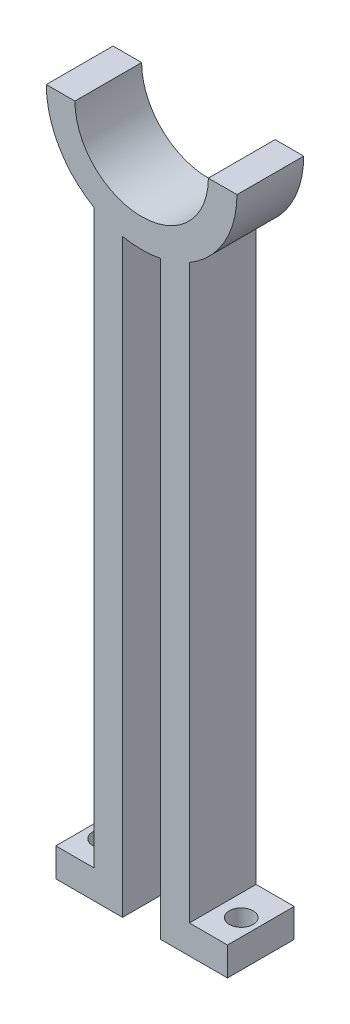
ISO-10303-21;
HEADER;
FILE_DESCRIPTION(('STEP AP214'),'2;1');
FILE_NAME('part.step','',(''),(''),'','','');
FILE_SCHEMA(('AUTOMOTIVE_DESIGN { 1 0 10303 214 1 1 1 1 }'));
ENDSEC;
DATA;
#1=APPLICATION_CONTEXT('core data for automotive mechanical design processes');
#2=APPLICATION_PROTOCOL_DEFINITION('international standard','automotive_design',2000,#1);
#3=PRODUCT_CONTEXT('',#1,'mechanical');
#4=PRODUCT('Part','Part','',(#3));
#5=PRODUCT_RELATED_PRODUCT_CATEGORY('part','',(#4));
#6=PRODUCT_DEFINITION_FORMATION('','',#4);
#7=PRODUCT_DEFINITION_CONTEXT('part definition',#1,'design');
#8=PRODUCT_DEFINITION('design','',#6,#7);
#9=PRODUCT_DEFINITION_SHAPE('','',#8);
#10=(LENGTH_UNIT() NAMED_UNIT(*) SI_UNIT(.MILLI.,.METRE.));
#11=(NAMED_UNIT(*) PLANE_ANGLE_UNIT() SI_UNIT($,.RADIAN.));
#12=(NAMED_UNIT(*) SI_UNIT($,.STERADIAN.) SOLID_ANGLE_UNIT());
#13=UNCERTAINTY_MEASURE_WITH_UNIT(LENGTH_MEASURE(1.E-05),#10,'distance_accuracy_value','');
#14=(GEOMETRIC_REPRESENTATION_CONTEXT(3) GLOBAL_UNCERTAINTY_ASSIGNED_CONTEXT((#13)) GLOBAL_UNIT_ASSIGNED_CONTEXT((#10,
#11,#12)) REPRESENTATION_CONTEXT('',''));
#15=CARTESIAN_POINT('',(0.,0.,0.));
#16=DIRECTION('',(0.,0.,1.));
#17=DIRECTION('',(1.,0.,0.));
#18=AXIS2_PLACEMENT_3D('',#15,#16,#17);
#19=CARTESIAN_POINT('',(0.,0.,7.));
#20=DIRECTION('',(0.,0.,-1.));
#21=DIRECTION('',(-1.,0.,0.));
#22=AXIS2_PLACEMENT_3D('',#19,#20,#21);
#23=CYLINDRICAL_SURFACE('',#22,7.);
#24=CARTESIAN_POINT('',(0.,0.,0.));
#25=DIRECTION('',(0.,0.,-1.));
#26=DIRECTION('',(1.,0.,0.));
#27=AXIS2_PLACEMENT_3D('',#24,#25,#26);
#28=CIRCLE('',#27,7.);
#29=CARTESIAN_POINT('',(7.,0.,0.));
#30=VERTEX_POINT('',#29);
#31=CARTESIAN_POINT('',(-7.,0.,0.));
#32=VERTEX_POINT('',#31);
#33=EDGE_CURVE('E184',#30,#32,#28,.T.);
#34=ORIENTED_EDGE('',*,*,#33,.T.);
#35=DIRECTION('',(0.,0.,-1.));
#36=VECTOR('',#35,1.);
#37=CARTESIAN_POINT('',(-7.,0.,7.));
#38=LINE('',#37,#36);
#39=CARTESIAN_POINT('',(-7.,0.,7.));
#40=VERTEX_POINT('',#39);
#41=EDGE_CURVE('E11',#40,#32,#38,.T.);
#42=ORIENTED_EDGE('',*,*,#41,.F.);
#43=CARTESIAN_POINT('',(0.,0.,7.));
#44=DIRECTION('',(0.,0.,-1.));
#45=DIRECTION('',(1.,0.,0.));
#46=AXIS2_PLACEMENT_3D('',#43,#44,#45);
#47=CIRCLE('',#46,7.);
#48=CARTESIAN_POINT('',(7.,0.,7.));
#49=VERTEX_POINT('',#48);
#50=EDGE_CURVE('E214',#49,#40,#47,.T.);
#51=ORIENTED_EDGE('',*,*,#50,.F.);
#52=DIRECTION('',(0.,0.,-1.));
#53=VECTOR('',#52,1.);
#54=CARTESIAN_POINT('',(7.,0.,7.));
#55=LINE('',#54,#53);
#56=EDGE_CURVE('E180',#49,#30,#55,.T.);
#57=ORIENTED_EDGE('',*,*,#56,.T.);
#58=EDGE_LOOP('',(#34,#42,#51,#57));
#59=FACE_BOUND('',#58,.T.);
#60=ADVANCED_FACE('F39',(#59),#23,.F.);
#61=CARTESIAN_POINT('',(-10.,0.,7.));
#62=DIRECTION('',(0.,-1.,0.));
#63=DIRECTION('',(0.,0.,-1.));
#64=AXIS2_PLACEMENT_3D('',#61,#62,#63);
#65=PLANE('',#64);
#66=DIRECTION('',(-1.,0.,0.));
#67=VECTOR('',#66,1.);
#68=CARTESIAN_POINT('',(-10.,0.,0.));
#69=LINE('',#68,#67);
#70=CARTESIAN_POINT('',(-10.,0.,0.));
#71=VERTEX_POINT('',#70);
#72=EDGE_CURVE('E187',#32,#71,#69,.T.);
#73=ORIENTED_EDGE('',*,*,#72,.T.);
#74=DIRECTION('',(0.,0.,-1.));
#75=VECTOR('',#74,1.);
#76=CARTESIAN_POINT('',(-10.,0.,7.));
#77=LINE('',#76,#75);
#78=CARTESIAN_POINT('',(-10.,0.,7.));
#79=VERTEX_POINT('',#78);
#80=EDGE_CURVE('E48',#79,#71,#77,.T.);
#81=ORIENTED_EDGE('',*,*,#80,.F.);
#82=DIRECTION('',(-1.,0.,0.));
#83=VECTOR('',#82,1.);
#84=CARTESIAN_POINT('',(-10.,0.,7.));
#85=LINE('',#84,#83);
#86=EDGE_CURVE('E123',#40,#79,#85,.T.);
#87=ORIENTED_EDGE('',*,*,#86,.F.);
#88=ORIENTED_EDGE('',*,*,#41,.T.);
#89=EDGE_LOOP('',(#73,#81,#87,#88));
#90=FACE_BOUND('',#89,.T.);
#91=ADVANCED_FACE('F313',(#90),#65,.F.);
#92=CARTESIAN_POINT('',(0.,0.,7.));
#93=DIRECTION('',(0.,0.,-1.));
#94=DIRECTION('',(-1.,0.,0.));
#95=AXIS2_PLACEMENT_3D('',#92,#93,#94);
#96=CYLINDRICAL_SURFACE('',#95,10.);
#97=CARTESIAN_POINT('',(0.,0.,0.));
#98=DIRECTION('',(0.,0.,1.));
#99=DIRECTION('',(1.,0.,0.));
#100=AXIS2_PLACEMENT_3D('',#97,#98,#99);
#101=CIRCLE('',#100,10.);
#102=CARTESIAN_POINT('',(-5.00488275949541,-8.65743313943028,0.));
#103=VERTEX_POINT('',#102);
#104=EDGE_CURVE('E189',#71,#103,#101,.T.);
#105=ORIENTED_EDGE('',*,*,#104,.T.);
#106=DIRECTION('',(0.,0.,-1.));
#107=VECTOR('',#106,1.);
#108=CARTESIAN_POINT('',(-5.00488275949541,-8.65743313943028,7.));
#109=LINE('',#108,#107);
#110=CARTESIAN_POINT('',(-5.00488275949541,-8.65743313943028,7.));
#111=VERTEX_POINT('',#110);
#112=EDGE_CURVE('E245',#111,#103,#109,.T.);
#113=ORIENTED_EDGE('',*,*,#112,.F.);
#114=CARTESIAN_POINT('',(0.,0.,7.));
#115=DIRECTION('',(0.,0.,1.));
#116=DIRECTION('',(1.,0.,0.));
#117=AXIS2_PLACEMENT_3D('',#114,#115,#116);
#118=CIRCLE('',#117,10.);
#119=EDGE_CURVE('E254',#79,#111,#118,.T.);
#120=ORIENTED_EDGE('',*,*,#119,.F.);
#121=ORIENTED_EDGE('',*,*,#80,.T.);
#122=EDGE_LOOP('',(#105,#113,#120,#121));
#123=FACE_BOUND('',#122,.T.);
#124=ADVANCED_FACE('F252',(#123),#96,.T.);
#125=CARTESIAN_POINT('',(-5.00488275949541,-8.65743313943028,7.));
#126=DIRECTION('',(1.,0.,0.));
#127=DIRECTION('',(0.,1.,0.));
#128=AXIS2_PLACEMENT_3D('',#125,#126,#127);
#129=PLANE('',#128);
#130=DIRECTION('',(0.,-1.,0.));
#131=VECTOR('',#130,1.);
#132=CARTESIAN_POINT('',(-5.00488275949541,-8.65743313943028,0.));
#133=LINE('',#132,#131);
#134=CARTESIAN_POINT('',(-5.0048827594954,-68.6574331394303,0.));
#135=VERTEX_POINT('',#134);
#136=EDGE_CURVE('E191',#103,#135,#133,.T.);
#137=ORIENTED_EDGE('',*,*,#136,.T.);
#138=DIRECTION('',(0.,0.,-1.));
#139=VECTOR('',#138,1.);
#140=CARTESIAN_POINT('',(-5.0048827594954,-68.6574331394303,7.));
#141=LINE('',#140,#139);
#142=CARTESIAN_POINT('',(-5.0048827594954,-68.6574331394303,7.));
#143=VERTEX_POINT('',#142);
#144=EDGE_CURVE('E242',#143,#135,#141,.T.);
#145=ORIENTED_EDGE('',*,*,#144,.F.);
#146=DIRECTION('',(0.,-1.,0.));
#147=VECTOR('',#146,1.);
#148=CARTESIAN_POINT('',(-5.00488275949541,-8.65743313943028,7.));
#149=LINE('',#148,#147);
#150=EDGE_CURVE('E272',#111,#143,#149,.T.);
#151=ORIENTED_EDGE('',*,*,#150,.F.);
#152=ORIENTED_EDGE('',*,*,#112,.T.);
#153=EDGE_LOOP('',(#137,#145,#151,#152));
#154=FACE_BOUND('',#153,.T.);
#155=ADVANCED_FACE('F263',(#154),#129,.F.);
#156=CARTESIAN_POINT('',(-5.0048827594954,-68.6574331394303,7.));
#157=DIRECTION('',(0.,-1.,0.));
#158=DIRECTION('',(0.,0.,-1.));
#159=AXIS2_PLACEMENT_3D('',#156,#157,#158);
#160=PLANE('',#159);
#161=CARTESIAN_POINT('',(-7.0845263963335,-68.6574331394303,3.79533670718279));
#162=DIRECTION('',(0.,1.,0.));
#163=DIRECTION('',(0.,0.,1.));
#164=AXIS2_PLACEMENT_3D('',#161,#162,#163);
#165=CIRCLE('',#164,1.25);
#166=CARTESIAN_POINT('',(-7.0845263963335,-68.6574331394303,5.04533670718279));
#167=VERTEX_POINT('',#166);
#168=EDGE_CURVE('E563',#167,#167,#165,.T.);
#169=ORIENTED_EDGE('',*,*,#168,.F.);
#170=EDGE_LOOP('',(#169));
#171=FACE_BOUND('',#170,.T.);
#172=DIRECTION('',(-1.,0.,0.));
#173=VECTOR('',#172,1.);
#174=CARTESIAN_POINT('',(-5.0048827594954,-68.6574331394303,0.));
#175=LINE('',#174,#173);
#176=CARTESIAN_POINT('',(-9.0048827594954,-68.6574331394303,0.));
#177=VERTEX_POINT('',#176);
#178=EDGE_CURVE('E193',#135,#177,#175,.T.);
#179=ORIENTED_EDGE('',*,*,#178,.T.);
#180=DIRECTION('',(0.,0.,-1.));
#181=VECTOR('',#180,1.);
#182=CARTESIAN_POINT('',(-9.0048827594954,-68.6574331394303,7.));
#183=LINE('',#182,#181);
#184=CARTESIAN_POINT('',(-9.0048827594954,-68.6574331394303,7.));
#185=VERTEX_POINT('',#184);
#186=EDGE_CURVE('E239',#185,#177,#183,.T.);
#187=ORIENTED_EDGE('',*,*,#186,.F.);
#188=DIRECTION('',(-1.,0.,0.));
#189=VECTOR('',#188,1.);
#190=CARTESIAN_POINT('',(-5.0048827594954,-68.6574331394303,7.));
#191=LINE('',#190,#189);
#192=EDGE_CURVE('E269',#143,#185,#191,.T.);
#193=ORIENTED_EDGE('',*,*,#192,.F.);
#194=ORIENTED_EDGE('',*,*,#144,.T.);
#195=EDGE_LOOP('',(#179,#187,#193,#194));
#196=FACE_BOUND('',#195,.T.);
#197=ADVANCED_FACE('F267',(#171,#196),#160,.F.);
#198=CARTESIAN_POINT('',(-9.0048827594954,-68.6574331394303,7.));
#199=DIRECTION('',(1.,0.,0.));
#200=DIRECTION('',(0.,1.,0.));
#201=AXIS2_PLACEMENT_3D('',#198,#199,#200);
#202=PLANE('',#201);
#203=DIRECTION('',(0.,-1.,0.));
#204=VECTOR('',#203,1.);
#205=CARTESIAN_POINT('',(-9.0048827594954,-68.6574331394303,0.));
#206=LINE('',#205,#204);
#207=CARTESIAN_POINT('',(-9.0048827594954,-71.6574331394303,0.));
#208=VERTEX_POINT('',#207);
#209=EDGE_CURVE('E195',#177,#208,#206,.T.);
#210=ORIENTED_EDGE('',*,*,#209,.T.);
#211=DIRECTION('',(0.,0.,-1.));
#212=VECTOR('',#211,1.);
#213=CARTESIAN_POINT('',(-9.0048827594954,-71.6574331394303,7.));
#214=LINE('',#213,#212);
#215=CARTESIAN_POINT('',(-9.0048827594954,-71.6574331394303,7.));
#216=VERTEX_POINT('',#215);
#217=EDGE_CURVE('E236',#216,#208,#214,.T.);
#218=ORIENTED_EDGE('',*,*,#217,.F.);
#219=DIRECTION('',(0.,-1.,0.));
#220=VECTOR('',#219,1.);
#221=CARTESIAN_POINT('',(-9.0048827594954,-68.6574331394303,7.));
#222=LINE('',#221,#220);
#223=EDGE_CURVE('E271',#185,#216,#222,.T.);
#224=ORIENTED_EDGE('',*,*,#223,.F.);
#225=ORIENTED_EDGE('',*,*,#186,.T.);
#226=EDGE_LOOP('',(#210,#218,#224,#225));
#227=FACE_BOUND('',#226,.T.);
#228=ADVANCED_FACE('F326',(#227),#202,.F.);
#229=CARTESIAN_POINT('',(-9.0048827594954,-71.6574331394303,7.));
#230=DIRECTION('',(0.,1.,0.));
#231=DIRECTION('',(0.,0.,1.));
#232=AXIS2_PLACEMENT_3D('',#229,#230,#231);
#233=PLANE('',#232);
#234=CARTESIAN_POINT('',(-7.0845263963335,-71.6574331394303,3.79533670718279));
#235=DIRECTION('',(0.,1.,0.));
#236=DIRECTION('',(0.,0.,1.));
#237=AXIS2_PLACEMENT_3D('',#234,#235,#236);
#238=CIRCLE('',#237,1.25);
#239=CARTESIAN_POINT('',(-7.0845263963335,-71.6574331394303,5.04533670718279));
#240=VERTEX_POINT('',#239);
#241=EDGE_CURVE('E42',#240,#240,#238,.T.);
#242=ORIENTED_EDGE('',*,*,#241,.T.);
#243=EDGE_LOOP('',(#242));
#244=FACE_BOUND('',#243,.T.);
#245=DIRECTION('',(1.,0.,0.));
#246=VECTOR('',#245,1.);
#247=CARTESIAN_POINT('',(-9.0048827594954,-71.6574331394303,0.));
#248=LINE('',#247,#246);
#249=CARTESIAN_POINT('',(-2.0048827594954,-71.6574331394303,0.));
#250=VERTEX_POINT('',#249);
#251=EDGE_CURVE('E197',#208,#250,#248,.T.);
#252=ORIENTED_EDGE('',*,*,#251,.T.);
#253=DIRECTION('',(0.,0.,-1.));
#254=VECTOR('',#253,1.);
#255=CARTESIAN_POINT('',(-2.0048827594954,-71.6574331394303,7.));
#256=LINE('',#255,#254);
#257=CARTESIAN_POINT('',(-2.0048827594954,-71.6574331394303,7.));
#258=VERTEX_POINT('',#257);
#259=EDGE_CURVE('E233',#258,#250,#256,.T.);
#260=ORIENTED_EDGE('',*,*,#259,.F.);
#261=DIRECTION('',(1.,0.,0.));
#262=VECTOR('',#261,1.);
#263=CARTESIAN_POINT('',(-9.0048827594954,-71.6574331394303,7.));
#264=LINE('',#263,#262);
#265=EDGE_CURVE('E274',#216,#258,#264,.T.);
#266=ORIENTED_EDGE('',*,*,#265,.F.);
#267=ORIENTED_EDGE('',*,*,#217,.T.);
#268=EDGE_LOOP('',(#252,#260,#266,#267));
#269=FACE_BOUND('',#268,.T.);
#270=ADVANCED_FACE('F330',(#244,#269),#233,.F.);
#271=CARTESIAN_POINT('',(-2.0048827594954,-71.6574331394303,7.));
#272=DIRECTION('',(-1.,0.,0.));
#273=DIRECTION('',(0.,-1.,0.));
#274=AXIS2_PLACEMENT_3D('',#271,#272,#273);
#275=PLANE('',#274);
#276=DIRECTION('',(0.,1.,0.));
#277=VECTOR('',#276,1.);
#278=CARTESIAN_POINT('',(-2.0048827594954,-71.6574331394303,0.));
#279=LINE('',#278,#277);
#280=CARTESIAN_POINT('',(-2.00488275949541,-9.79696101455334,0.));
#281=VERTEX_POINT('',#280);
#282=EDGE_CURVE('E199',#250,#281,#279,.T.);
#283=ORIENTED_EDGE('',*,*,#282,.T.);
#284=DIRECTION('',(0.,0.,-1.));
#285=VECTOR('',#284,1.);
#286=CARTESIAN_POINT('',(-2.00488275949541,-9.79696101455334,7.));
#287=LINE('',#286,#285);
#288=CARTESIAN_POINT('',(-2.00488275949541,-9.79696101455334,7.));
#289=VERTEX_POINT('',#288);
#290=EDGE_CURVE('E230',#289,#281,#287,.T.);
#291=ORIENTED_EDGE('',*,*,#290,.F.);
#292=DIRECTION('',(0.,1.,0.));
#293=VECTOR('',#292,1.);
#294=CARTESIAN_POINT('',(-2.0048827594954,-71.6574331394303,7.));
#295=LINE('',#294,#293);
#296=EDGE_CURVE('E280',#258,#289,#295,.T.);
#297=ORIENTED_EDGE('',*,*,#296,.F.);
#298=ORIENTED_EDGE('',*,*,#259,.T.);
#299=EDGE_LOOP('',(#283,#291,#297,#298));
#300=FACE_BOUND('',#299,.T.);
#301=ADVANCED_FACE('F334',(#300),#275,.F.);
#302=CARTESIAN_POINT('',(0.,0.,7.));
#303=DIRECTION('',(0.,0.,-1.));
#304=DIRECTION('',(-1.,0.,0.));
#305=AXIS2_PLACEMENT_3D('',#302,#303,#304);
#306=CYLINDRICAL_SURFACE('',#305,10.);
#307=CARTESIAN_POINT('',(0.,0.,0.));
#308=DIRECTION('',(0.,0.,1.));
#309=DIRECTION('',(1.,0.,0.));
#310=AXIS2_PLACEMENT_3D('',#307,#308,#309);
#311=CIRCLE('',#310,10.);
#312=CARTESIAN_POINT('',(2.0048827594954,-9.79696101455334,0.));
#313=VERTEX_POINT('',#312);
#314=EDGE_CURVE('E201',#281,#313,#311,.T.);
#315=ORIENTED_EDGE('',*,*,#314,.T.);
#316=DIRECTION('',(0.,0.,-1.));
#317=VECTOR('',#316,1.);
#318=CARTESIAN_POINT('',(2.0048827594954,-9.79696101455334,7.));
#319=LINE('',#318,#317);
#320=CARTESIAN_POINT('',(2.0048827594954,-9.79696101455334,7.));
#321=VERTEX_POINT('',#320);
#322=EDGE_CURVE('E227',#321,#313,#319,.T.);
#323=ORIENTED_EDGE('',*,*,#322,.F.);
#324=CARTESIAN_POINT('',(0.,0.,7.));
#325=DIRECTION('',(0.,0.,1.));
#326=DIRECTION('',(1.,0.,0.));
#327=AXIS2_PLACEMENT_3D('',#324,#325,#326);
#328=CIRCLE('',#327,10.);
#329=EDGE_CURVE('E282',#289,#321,#328,.T.);
#330=ORIENTED_EDGE('',*,*,#329,.F.);
#331=ORIENTED_EDGE('',*,*,#290,.T.);
#332=EDGE_LOOP('',(#315,#323,#330,#331));
#333=FACE_BOUND('',#332,.T.);
#334=ADVANCED_FACE('F338',(#333),#306,.T.);
#335=CARTESIAN_POINT('',(2.00488275949542,-71.6574331394303,7.));
#336=DIRECTION('',(1.,0.,0.));
#337=DIRECTION('',(0.,1.,0.));
#338=AXIS2_PLACEMENT_3D('',#335,#336,#337);
#339=PLANE('',#338);
#340=DIRECTION('',(0.,-1.,0.));
#341=VECTOR('',#340,1.);
#342=CARTESIAN_POINT('',(2.00488275949542,-71.6574331394303,0.));
#343=LINE('',#342,#341);
#344=CARTESIAN_POINT('',(2.00488275949542,-71.6574331394303,0.));
#345=VERTEX_POINT('',#344);
#346=EDGE_CURVE('E203',#313,#345,#343,.T.);
#347=ORIENTED_EDGE('',*,*,#346,.T.);
#348=DIRECTION('',(0.,0.,-1.));
#349=VECTOR('',#348,1.);
#350=CARTESIAN_POINT('',(2.00488275949542,-71.6574331394303,7.));
#351=LINE('',#350,#349);
#352=CARTESIAN_POINT('',(2.00488275949542,-71.6574331394303,7.));
#353=VERTEX_POINT('',#352);
#354=EDGE_CURVE('E224',#353,#345,#351,.T.);
#355=ORIENTED_EDGE('',*,*,#354,.F.);
#356=DIRECTION('',(0.,-1.,0.));
#357=VECTOR('',#356,1.);
#358=CARTESIAN_POINT('',(2.00488275949542,-71.6574331394303,7.));
#359=LINE('',#358,#357);
#360=EDGE_CURVE('E284',#321,#353,#359,.T.);
#361=ORIENTED_EDGE('',*,*,#360,.F.);
#362=ORIENTED_EDGE('',*,*,#322,.T.);
#363=EDGE_LOOP('',(#347,#355,#361,#362));
#364=FACE_BOUND('',#363,.T.);
#365=ADVANCED_FACE('F342',(#364),#339,.F.);
#366=CARTESIAN_POINT('',(9.00488275949542,-71.6574331394303,7.));
#367=DIRECTION('',(0.,1.,0.));
#368=DIRECTION('',(0.,0.,1.));
#369=AXIS2_PLACEMENT_3D('',#366,#367,#368);
#370=PLANE('',#369);
#371=CARTESIAN_POINT('',(7.23936675835724,-71.6574331394303,3.79533670718279));
#372=DIRECTION('',(0.,1.,0.));
#373=DIRECTION('',(0.,0.,1.));
#374=AXIS2_PLACEMENT_3D('',#371,#372,#373);
#375=CIRCLE('',#374,1.25);
#376=CARTESIAN_POINT('',(7.23936675835724,-71.6574331394303,5.04533670718279));
#377=VERTEX_POINT('',#376);
#378=EDGE_CURVE('E566',#377,#377,#375,.T.);
#379=ORIENTED_EDGE('',*,*,#378,.T.);
#380=EDGE_LOOP('',(#379));
#381=FACE_BOUND('',#380,.T.);
#382=DIRECTION('',(1.,0.,0.));
#383=VECTOR('',#382,1.);
#384=CARTESIAN_POINT('',(9.00488275949542,-71.6574331394303,0.));
#385=LINE('',#384,#383);
#386=CARTESIAN_POINT('',(9.00488275949542,-71.6574331394303,0.));
#387=VERTEX_POINT('',#386);
#388=EDGE_CURVE('E205',#345,#387,#385,.T.);
#389=ORIENTED_EDGE('',*,*,#388,.T.);
#390=DIRECTION('',(0.,0.,-1.));
#391=VECTOR('',#390,1.);
#392=CARTESIAN_POINT('',(9.00488275949542,-71.6574331394303,7.));
#393=LINE('',#392,#391);
#394=CARTESIAN_POINT('',(9.00488275949542,-71.6574331394303,7.));
#395=VERTEX_POINT('',#394);
#396=EDGE_CURVE('E221',#395,#387,#393,.T.);
#397=ORIENTED_EDGE('',*,*,#396,.F.);
#398=DIRECTION('',(1.,0.,0.));
#399=VECTOR('',#398,1.);
#400=CARTESIAN_POINT('',(9.00488275949542,-71.6574331394303,7.));
#401=LINE('',#400,#399);
#402=EDGE_CURVE('E286',#353,#395,#401,.T.);
#403=ORIENTED_EDGE('',*,*,#402,.F.);
#404=ORIENTED_EDGE('',*,*,#354,.T.);
#405=EDGE_LOOP('',(#389,#397,#403,#404));
#406=FACE_BOUND('',#405,.T.);
#407=ADVANCED_FACE('F346',(#381,#406),#370,.F.);
#408=CARTESIAN_POINT('',(9.00488275949542,-68.6574331394303,7.));
#409=DIRECTION('',(-1.,0.,0.));
#410=DIRECTION('',(0.,-1.,0.));
#411=AXIS2_PLACEMENT_3D('',#408,#409,#410);
#412=PLANE('',#411);
#413=DIRECTION('',(0.,1.,0.));
#414=VECTOR('',#413,1.);
#415=CARTESIAN_POINT('',(9.00488275949542,-68.6574331394303,0.));
#416=LINE('',#415,#414);
#417=CARTESIAN_POINT('',(9.00488275949542,-68.6574331394303,0.));
#418=VERTEX_POINT('',#417);
#419=EDGE_CURVE('E207',#387,#418,#416,.T.);
#420=ORIENTED_EDGE('',*,*,#419,.T.);
#421=DIRECTION('',(0.,0.,-1.));
#422=VECTOR('',#421,1.);
#423=CARTESIAN_POINT('',(9.00488275949542,-68.6574331394303,7.));
#424=LINE('',#423,#422);
#425=CARTESIAN_POINT('',(9.00488275949542,-68.6574331394303,7.));
#426=VERTEX_POINT('',#425);
#427=EDGE_CURVE('E218',#426,#418,#424,.T.);
#428=ORIENTED_EDGE('',*,*,#427,.F.);
#429=DIRECTION('',(0.,1.,0.));
#430=VECTOR('',#429,1.);
#431=CARTESIAN_POINT('',(9.00488275949542,-68.6574331394303,7.));
#432=LINE('',#431,#430);
#433=EDGE_CURVE('E288',#395,#426,#432,.T.);
#434=ORIENTED_EDGE('',*,*,#433,.F.);
#435=ORIENTED_EDGE('',*,*,#396,.T.);
#436=EDGE_LOOP('',(#420,#428,#434,#435));
#437=FACE_BOUND('',#436,.T.);
#438=ADVANCED_FACE('F294',(#437),#412,.F.);
#439=CARTESIAN_POINT('',(5.00488275949542,-68.6574331394303,7.));
#440=DIRECTION('',(0.,-1.,0.));
#441=DIRECTION('',(0.,0.,-1.));
#442=AXIS2_PLACEMENT_3D('',#439,#440,#441);
#443=PLANE('',#442);
#444=CARTESIAN_POINT('',(7.23936675835724,-68.6574331394303,3.79533670718279));
#445=DIRECTION('',(0.,1.,0.));
#446=DIRECTION('',(0.,0.,1.));
#447=AXIS2_PLACEMENT_3D('',#444,#445,#446);
#448=CIRCLE('',#447,1.25);
#449=CARTESIAN_POINT('',(7.23936675835724,-68.6574331394303,5.04533670718279));
#450=VERTEX_POINT('',#449);
#451=EDGE_CURVE('E570',#450,#450,#448,.T.);
#452=ORIENTED_EDGE('',*,*,#451,.F.);
#453=EDGE_LOOP('',(#452));
#454=FACE_BOUND('',#453,.T.);
#455=DIRECTION('',(-1.,0.,0.));
#456=VECTOR('',#455,1.);
#457=CARTESIAN_POINT('',(5.00488275949542,-68.6574331394303,0.));
#458=LINE('',#457,#456);
#459=CARTESIAN_POINT('',(5.00488275949542,-68.6574331394303,0.));
#460=VERTEX_POINT('',#459);
#461=EDGE_CURVE('E209',#418,#460,#458,.T.);
#462=ORIENTED_EDGE('',*,*,#461,.T.);
#463=DIRECTION('',(0.,0.,-1.));
#464=VECTOR('',#463,1.);
#465=CARTESIAN_POINT('',(5.00488275949542,-68.6574331394303,7.));
#466=LINE('',#465,#464);
#467=CARTESIAN_POINT('',(5.00488275949542,-68.6574331394303,7.));
#468=VERTEX_POINT('',#467);
#469=EDGE_CURVE('E175',#468,#460,#466,.T.);
#470=ORIENTED_EDGE('',*,*,#469,.F.);
#471=DIRECTION('',(-1.,0.,0.));
#472=VECTOR('',#471,1.);
#473=CARTESIAN_POINT('',(5.00488275949542,-68.6574331394303,7.));
#474=LINE('',#473,#472);
#475=EDGE_CURVE('E166',#426,#468,#474,.T.);
#476=ORIENTED_EDGE('',*,*,#475,.F.);
#477=ORIENTED_EDGE('',*,*,#427,.T.);
#478=EDGE_LOOP('',(#462,#470,#476,#477));
#479=FACE_BOUND('',#478,.T.);
#480=ADVANCED_FACE('F298',(#454,#479),#443,.F.);
#481=CARTESIAN_POINT('',(5.00488275949541,-8.65743313943028,7.));
#482=DIRECTION('',(-1.,0.,0.));
#483=DIRECTION('',(0.,-1.,0.));
#484=AXIS2_PLACEMENT_3D('',#481,#482,#483);
#485=PLANE('',#484);
#486=DIRECTION('',(0.,1.,0.));
#487=VECTOR('',#486,1.);
#488=CARTESIAN_POINT('',(5.00488275949541,-8.65743313943028,0.));
#489=LINE('',#488,#487);
#490=CARTESIAN_POINT('',(5.0048827594954,-8.65743313943028,0.));
#491=VERTEX_POINT('',#490);
#492=EDGE_CURVE('E174',#460,#491,#489,.T.);
#493=ORIENTED_EDGE('',*,*,#492,.T.);
#494=DIRECTION('',(0.,0.,-1.));
#495=VECTOR('',#494,1.);
#496=CARTESIAN_POINT('',(5.0048827594954,-8.65743313943028,7.));
#497=LINE('',#496,#495);
#498=CARTESIAN_POINT('',(5.0048827594954,-8.65743313943028,7.));
#499=VERTEX_POINT('',#498);
#500=EDGE_CURVE('E171',#499,#491,#497,.T.);
#501=ORIENTED_EDGE('',*,*,#500,.F.);
#502=DIRECTION('',(0.,1.,0.));
#503=VECTOR('',#502,1.);
#504=CARTESIAN_POINT('',(5.00488275949541,-8.65743313943028,7.));
#505=LINE('',#504,#503);
#506=EDGE_CURVE('E160',#468,#499,#505,.T.);
#507=ORIENTED_EDGE('',*,*,#506,.F.);
#508=ORIENTED_EDGE('',*,*,#469,.T.);
#509=EDGE_LOOP('',(#493,#501,#507,#508));
#510=FACE_BOUND('',#509,.T.);
#511=ADVANCED_FACE('F172',(#510),#485,.F.);
#512=CARTESIAN_POINT('',(0.,0.,7.));
#513=DIRECTION('',(0.,0.,-1.));
#514=DIRECTION('',(-1.,0.,0.));
#515=AXIS2_PLACEMENT_3D('',#512,#513,#514);
#516=CYLINDRICAL_SURFACE('',#515,10.);
#517=CARTESIAN_POINT('',(0.,0.,0.));
#518=DIRECTION('',(0.,0.,1.));
#519=DIRECTION('',(1.,0.,0.));
#520=AXIS2_PLACEMENT_3D('',#517,#518,#519);
#521=CIRCLE('',#520,10.);
#522=CARTESIAN_POINT('',(10.,0.,0.));
#523=VERTEX_POINT('',#522);
#524=EDGE_CURVE('E109',#491,#523,#521,.T.);
#525=ORIENTED_EDGE('',*,*,#524,.T.);
#526=DIRECTION('',(0.,0.,-1.));
#527=VECTOR('',#526,1.);
#528=CARTESIAN_POINT('',(10.,0.,7.));
#529=LINE('',#528,#527);
#530=CARTESIAN_POINT('',(10.,0.,7.));
#531=VERTEX_POINT('',#530);
#532=EDGE_CURVE('E176',#531,#523,#529,.T.);
#533=ORIENTED_EDGE('',*,*,#532,.F.);
#534=CARTESIAN_POINT('',(0.,0.,7.));
#535=DIRECTION('',(0.,0.,1.));
#536=DIRECTION('',(1.,0.,0.));
#537=AXIS2_PLACEMENT_3D('',#534,#535,#536);
#538=CIRCLE('',#537,10.);
#539=EDGE_CURVE('E164',#499,#531,#538,.T.);
#540=ORIENTED_EDGE('',*,*,#539,.F.);
#541=ORIENTED_EDGE('',*,*,#500,.T.);
#542=EDGE_LOOP('',(#525,#533,#540,#541));
#543=FACE_BOUND('',#542,.T.);
#544=ADVANCED_FACE('F178',(#543),#516,.T.);
#545=CARTESIAN_POINT('',(7.,0.,7.));
#546=DIRECTION('',(0.,-1.,0.));
#547=DIRECTION('',(0.,0.,-1.));
#548=AXIS2_PLACEMENT_3D('',#545,#546,#547);
#549=PLANE('',#548);
#550=DIRECTION('',(-1.,0.,0.));
#551=VECTOR('',#550,1.);
#552=CARTESIAN_POINT('',(7.,0.,0.));
#553=LINE('',#552,#551);
#554=EDGE_CURVE('E115',#523,#30,#553,.T.);
#555=ORIENTED_EDGE('',*,*,#554,.T.);
#556=ORIENTED_EDGE('',*,*,#56,.F.);
#557=DIRECTION('',(-1.,0.,0.));
#558=VECTOR('',#557,1.);
#559=CARTESIAN_POINT('',(7.,0.,7.));
#560=LINE('',#559,#558);
#561=EDGE_CURVE('E56',#531,#49,#560,.T.);
#562=ORIENTED_EDGE('',*,*,#561,.F.);
#563=ORIENTED_EDGE('',*,*,#532,.T.);
#564=EDGE_LOOP('',(#555,#556,#562,#563));
#565=FACE_BOUND('',#564,.T.);
#566=ADVANCED_FACE('F302',(#565),#549,.F.);
#567=CARTESIAN_POINT('',(0.,0.,7.));
#568=DIRECTION('',(0.,0.,1.));
#569=DIRECTION('',(1.,0.,0.));
#570=AXIS2_PLACEMENT_3D('',#567,#568,#569);
#571=PLANE('',#570);
#572=ORIENTED_EDGE('',*,*,#50,.T.);
#573=ORIENTED_EDGE('',*,*,#86,.T.);
#574=ORIENTED_EDGE('',*,*,#119,.T.);
#575=ORIENTED_EDGE('',*,*,#150,.T.);
#576=ORIENTED_EDGE('',*,*,#192,.T.);
#577=ORIENTED_EDGE('',*,*,#223,.T.);
#578=ORIENTED_EDGE('',*,*,#265,.T.);
#579=ORIENTED_EDGE('',*,*,#296,.T.);
#580=ORIENTED_EDGE('',*,*,#329,.T.);
#581=ORIENTED_EDGE('',*,*,#360,.T.);
#582=ORIENTED_EDGE('',*,*,#402,.T.);
#583=ORIENTED_EDGE('',*,*,#433,.T.);
#584=ORIENTED_EDGE('',*,*,#475,.T.);
#585=ORIENTED_EDGE('',*,*,#506,.T.);
#586=ORIENTED_EDGE('',*,*,#539,.T.);
#587=ORIENTED_EDGE('',*,*,#561,.T.);
#588=EDGE_LOOP('',(#572,#573,#574,#575,#576,#577,#578,#579,#580,#581,#582,#583,#584,#585,#586,#587));
#589=FACE_BOUND('',#588,.T.);
#590=ADVANCED_FACE('F162',(#589),#571,.T.);
#591=CARTESIAN_POINT('',(0.,0.,0.));
#592=DIRECTION('',(0.,0.,1.));
#593=DIRECTION('',(1.,0.,0.));
#594=AXIS2_PLACEMENT_3D('',#591,#592,#593);
#595=PLANE('',#594);
#596=ORIENTED_EDGE('',*,*,#33,.F.);
#597=ORIENTED_EDGE('',*,*,#554,.F.);
#598=ORIENTED_EDGE('',*,*,#524,.F.);
#599=ORIENTED_EDGE('',*,*,#492,.F.);
#600=ORIENTED_EDGE('',*,*,#461,.F.);
#601=ORIENTED_EDGE('',*,*,#419,.F.);
#602=ORIENTED_EDGE('',*,*,#388,.F.);
#603=ORIENTED_EDGE('',*,*,#346,.F.);
#604=ORIENTED_EDGE('',*,*,#314,.F.);
#605=ORIENTED_EDGE('',*,*,#282,.F.);
#606=ORIENTED_EDGE('',*,*,#251,.F.);
#607=ORIENTED_EDGE('',*,*,#209,.F.);
#608=ORIENTED_EDGE('',*,*,#178,.F.);
#609=ORIENTED_EDGE('',*,*,#136,.F.);
#610=ORIENTED_EDGE('',*,*,#104,.F.);
#611=ORIENTED_EDGE('',*,*,#72,.F.);
#612=EDGE_LOOP('',(#596,#597,#598,#599,#600,#601,#602,#603,#604,#605,#606,#607,#608,#609,#610,#611));
#613=FACE_BOUND('',#612,.T.);
#614=ADVANCED_FACE('F258',(#613),#595,.F.);
#615=CARTESIAN_POINT('',(7.23936675835724,-78.6574331394303,3.79533670718279));
#616=DIRECTION('',(0.,1.,0.));
#617=DIRECTION('',(0.,0.,1.));
#618=AXIS2_PLACEMENT_3D('',#615,#616,#617);
#619=CYLINDRICAL_SURFACE('',#618,1.25);
#620=ORIENTED_EDGE('',*,*,#451,.T.);
#621=EDGE_LOOP('',(#620));
#622=FACE_BOUND('',#621,.T.);
#623=ORIENTED_EDGE('',*,*,#378,.F.);
#624=EDGE_LOOP('',(#623));
#625=FACE_BOUND('',#624,.T.);
#626=ADVANCED_FACE('F384',(#622,#625),#619,.F.);
#627=CARTESIAN_POINT('',(-7.0845263963335,-78.6574331394303,3.79533670718279));
#628=DIRECTION('',(0.,1.,0.));
#629=DIRECTION('',(0.,0.,1.));
#630=AXIS2_PLACEMENT_3D('',#627,#628,#629);
#631=CYLINDRICAL_SURFACE('',#630,1.25);
#632=ORIENTED_EDGE('',*,*,#168,.T.);
#633=EDGE_LOOP('',(#632));
#634=FACE_BOUND('',#633,.T.);
#635=ORIENTED_EDGE('',*,*,#241,.F.);
#636=EDGE_LOOP('',(#635));
#637=FACE_BOUND('',#636,.T.);
#638=ADVANCED_FACE('F393',(#634,#637),#631,.F.);
#639=CLOSED_SHELL('',(#60,#91,#124,#155,#197,#228,#270,#301,#334,#365,#407,#438,#480,#511,#544,
#566,#590,#614,#626,#638));
#640=MANIFOLD_SOLID_BREP('B2',#639);
#641=ADVANCED_BREP_SHAPE_REPRESENTATION('',(#18,#640),#14);
#642=SHAPE_DEFINITION_REPRESENTATION(#9,#641);
ENDSEC;
END-ISO-10303-21;
